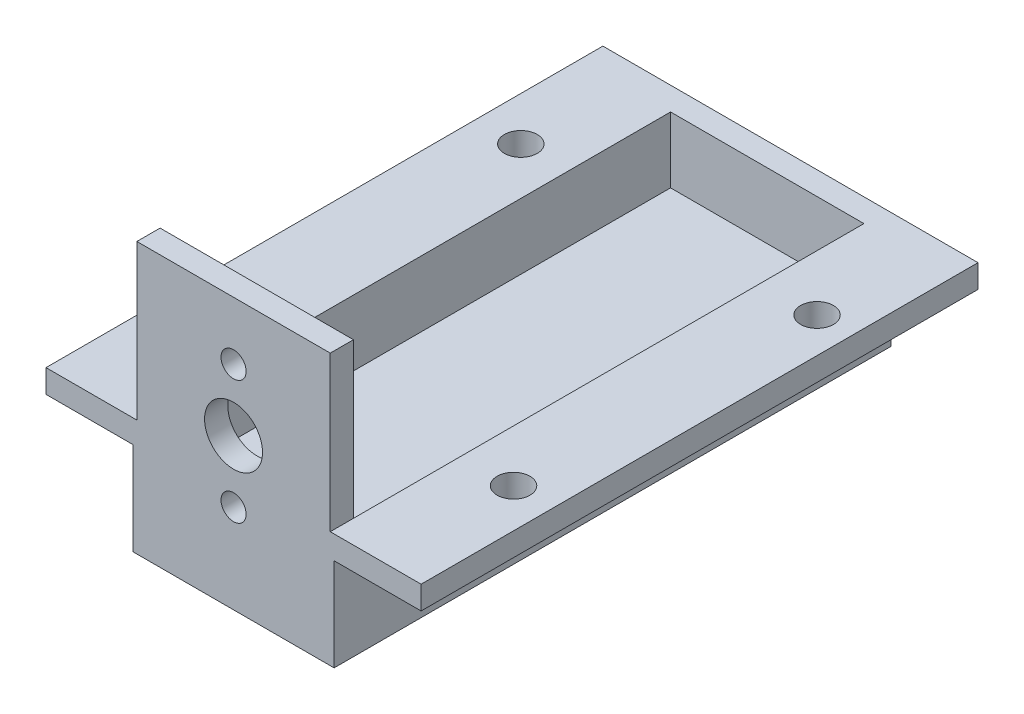
ISO-10303-21;
HEADER;
FILE_DESCRIPTION(('STEP AP214'),'2;1');
FILE_NAME('part.step','',(''),(''),'','','');
FILE_SCHEMA(('AUTOMOTIVE_DESIGN { 1 0 10303 214 1 1 1 1 }'));
ENDSEC;
DATA;
#1=APPLICATION_CONTEXT('core data for automotive mechanical design processes');
#2=APPLICATION_PROTOCOL_DEFINITION('international standard','automotive_design',2000,#1);
#3=PRODUCT_CONTEXT('',#1,'mechanical');
#4=PRODUCT('Part','Part','',(#3));
#5=PRODUCT_RELATED_PRODUCT_CATEGORY('part','',(#4));
#6=PRODUCT_DEFINITION_FORMATION('','',#4);
#7=PRODUCT_DEFINITION_CONTEXT('part definition',#1,'design');
#8=PRODUCT_DEFINITION('design','',#6,#7);
#9=PRODUCT_DEFINITION_SHAPE('','',#8);
#10=(LENGTH_UNIT() NAMED_UNIT(*) SI_UNIT(.MILLI.,.METRE.));
#11=(NAMED_UNIT(*) PLANE_ANGLE_UNIT() SI_UNIT($,.RADIAN.));
#12=(NAMED_UNIT(*) SI_UNIT($,.STERADIAN.) SOLID_ANGLE_UNIT());
#13=UNCERTAINTY_MEASURE_WITH_UNIT(LENGTH_MEASURE(1.E-05),#10,'distance_accuracy_value','');
#14=(GEOMETRIC_REPRESENTATION_CONTEXT(3) GLOBAL_UNCERTAINTY_ASSIGNED_CONTEXT((#13)) GLOBAL_UNIT_ASSIGNED_CONTEXT((#10,
#11,#12)) REPRESENTATION_CONTEXT('',''));
#15=CARTESIAN_POINT('',(0.,0.,0.));
#16=DIRECTION('',(0.,0.,1.));
#17=DIRECTION('',(1.,0.,0.));
#18=AXIS2_PLACEMENT_3D('',#15,#16,#17);
#19=CARTESIAN_POINT('',(12.5,0.,-72.));
#20=DIRECTION('',(1.,0.,0.));
#21=DIRECTION('',(0.,1.,0.));
#22=AXIS2_PLACEMENT_3D('',#19,#20,#21);
#23=PLANE('',#22);
#24=DIRECTION('',(0.,0.,1.));
#25=VECTOR('',#24,1.);
#26=CARTESIAN_POINT('',(12.5,0.,-72.));
#27=LINE('',#26,#25);
#28=CARTESIAN_POINT('',(12.5,0.,-2.99999999999999));
#29=VERTEX_POINT('',#28);
#30=CARTESIAN_POINT('',(12.5,0.,0.));
#31=VERTEX_POINT('',#30);
#32=EDGE_CURVE('E194',#29,#31,#27,.T.);
#33=ORIENTED_EDGE('',*,*,#32,.T.);
#34=DIRECTION('',(0.,-1.,0.));
#35=VECTOR('',#34,1.);
#36=CARTESIAN_POINT('',(12.5,0.,0.));
#37=LINE('',#36,#35);
#38=CARTESIAN_POINT('',(12.5,-20.,0.));
#39=VERTEX_POINT('',#38);
#40=EDGE_CURVE('E173',#31,#39,#37,.T.);
#41=ORIENTED_EDGE('',*,*,#40,.T.);
#42=DIRECTION('',(0.,0.,1.));
#43=VECTOR('',#42,1.);
#44=CARTESIAN_POINT('',(12.5,-20.,-72.));
#45=LINE('',#44,#43);
#46=CARTESIAN_POINT('',(12.5,-20.,-2.99999999999999));
#47=VERTEX_POINT('',#46);
#48=EDGE_CURVE('E197',#47,#39,#45,.T.);
#49=ORIENTED_EDGE('',*,*,#48,.F.);
#50=DIRECTION('',(0.,1.,0.));
#51=VECTOR('',#50,1.);
#52=CARTESIAN_POINT('',(12.5,0.,-2.99999999999999));
#53=LINE('',#52,#51);
#54=EDGE_CURVE('E265',#47,#29,#53,.T.);
#55=ORIENTED_EDGE('',*,*,#54,.T.);
#56=EDGE_LOOP('',(#33,#41,#49,#55));
#57=FACE_BOUND('',#56,.T.);
#58=ADVANCED_FACE('F43',(#57),#23,.T.);
#59=CARTESIAN_POINT('',(12.5,0.,-72.));
#60=DIRECTION('',(0.,-1.,0.));
#61=DIRECTION('',(0.,0.,1.));
#62=AXIS2_PLACEMENT_3D('',#59,#60,#61);
#63=PLANE('',#62);
#64=DIRECTION('',(-1.,0.,0.));
#65=VECTOR('',#64,1.);
#66=CARTESIAN_POINT('',(-12.5,0.,-2.99999999999999));
#67=LINE('',#66,#65);
#68=CARTESIAN_POINT('',(-12.5,0.,-2.99999999999999));
#69=VERTEX_POINT('',#68);
#70=EDGE_CURVE('E162',#29,#69,#67,.T.);
#71=ORIENTED_EDGE('',*,*,#70,.T.);
#72=DIRECTION('',(0.,0.,1.));
#73=VECTOR('',#72,1.);
#74=CARTESIAN_POINT('',(-12.5,0.,-72.));
#75=LINE('',#74,#73);
#76=CARTESIAN_POINT('',(-12.5,0.,0.));
#77=VERTEX_POINT('',#76);
#78=EDGE_CURVE('E191',#69,#77,#75,.T.);
#79=ORIENTED_EDGE('',*,*,#78,.T.);
#80=DIRECTION('',(-1.,0.,0.));
#81=VECTOR('',#80,1.);
#82=CARTESIAN_POINT('',(12.5,0.,0.));
#83=LINE('',#82,#81);
#84=EDGE_CURVE('E176',#31,#77,#83,.T.);
#85=ORIENTED_EDGE('',*,*,#84,.F.);
#86=ORIENTED_EDGE('',*,*,#32,.F.);
#87=EDGE_LOOP('',(#71,#79,#85,#86));
#88=FACE_BOUND('',#87,.T.);
#89=ADVANCED_FACE('F305',(#88),#63,.F.);
#90=CARTESIAN_POINT('',(-12.5,0.,-72.));
#91=DIRECTION('',(1.,0.,0.));
#92=DIRECTION('',(0.,1.,0.));
#93=AXIS2_PLACEMENT_3D('',#90,#91,#92);
#94=PLANE('',#93);
#95=DIRECTION('',(0.,-1.,0.));
#96=VECTOR('',#95,1.);
#97=CARTESIAN_POINT('',(-12.5,0.,-2.99999999999999));
#98=LINE('',#97,#96);
#99=CARTESIAN_POINT('',(-12.5,-20.,-2.99999999999999));
#100=VERTEX_POINT('',#99);
#101=EDGE_CURVE('E254',#69,#100,#98,.T.);
#102=ORIENTED_EDGE('',*,*,#101,.T.);
#103=DIRECTION('',(0.,0.,1.));
#104=VECTOR('',#103,1.);
#105=CARTESIAN_POINT('',(-12.5,-20.,-72.));
#106=LINE('',#105,#104);
#107=CARTESIAN_POINT('',(-12.5,-20.,0.));
#108=VERTEX_POINT('',#107);
#109=EDGE_CURVE('E143',#100,#108,#106,.T.);
#110=ORIENTED_EDGE('',*,*,#109,.T.);
#111=DIRECTION('',(0.,-1.,0.));
#112=VECTOR('',#111,1.);
#113=CARTESIAN_POINT('',(-12.5,0.,0.));
#114=LINE('',#113,#112);
#115=EDGE_CURVE('E179',#77,#108,#114,.T.);
#116=ORIENTED_EDGE('',*,*,#115,.F.);
#117=ORIENTED_EDGE('',*,*,#78,.F.);
#118=EDGE_LOOP('',(#102,#110,#116,#117));
#119=FACE_BOUND('',#118,.T.);
#120=ADVANCED_FACE('F311',(#119),#94,.F.);
#121=CARTESIAN_POINT('',(-13.,-23.,-72.));
#122=DIRECTION('',(1.,0.,0.));
#123=DIRECTION('',(0.,1.,0.));
#124=AXIS2_PLACEMENT_3D('',#121,#122,#123);
#125=PLANE('',#124);
#126=DIRECTION('',(0.,-1.,0.));
#127=VECTOR('',#126,1.);
#128=CARTESIAN_POINT('',(-13.,-23.,0.));
#129=LINE('',#128,#127);
#130=CARTESIAN_POINT('',(-13.,-23.,0.));
#131=VERTEX_POINT('',#130);
#132=CARTESIAN_POINT('',(-13.,-35.,0.));
#133=VERTEX_POINT('',#132);
#134=EDGE_CURVE('E159',#131,#133,#129,.T.);
#135=ORIENTED_EDGE('',*,*,#134,.F.);
#136=DIRECTION('',(0.,0.,1.));
#137=VECTOR('',#136,1.);
#138=CARTESIAN_POINT('',(-13.,-23.,-72.));
#139=LINE('',#138,#137);
#140=CARTESIAN_POINT('',(-13.,-23.,-72.));
#141=VERTEX_POINT('',#140);
#142=EDGE_CURVE('E158',#141,#131,#139,.T.);
#143=ORIENTED_EDGE('',*,*,#142,.F.);
#144=DIRECTION('',(0.,-1.,0.));
#145=VECTOR('',#144,1.);
#146=CARTESIAN_POINT('',(-13.,-23.,-72.));
#147=LINE('',#146,#145);
#148=CARTESIAN_POINT('',(-13.,-35.,-72.));
#149=VERTEX_POINT('',#148);
#150=EDGE_CURVE('E186',#141,#149,#147,.T.);
#151=ORIENTED_EDGE('',*,*,#150,.T.);
#152=DIRECTION('',(0.,0.,1.));
#153=VECTOR('',#152,1.);
#154=CARTESIAN_POINT('',(-13.,-35.,-72.));
#155=LINE('',#154,#153);
#156=EDGE_CURVE('E11',#149,#133,#155,.T.);
#157=ORIENTED_EDGE('',*,*,#156,.T.);
#158=EDGE_LOOP('',(#135,#143,#151,#157));
#159=FACE_BOUND('',#158,.T.);
#160=ADVANCED_FACE('F45',(#159),#125,.F.);
#161=CARTESIAN_POINT('',(-13.,-35.,-72.));
#162=DIRECTION('',(0.,1.,0.));
#163=DIRECTION('',(0.,0.,-1.));
#164=AXIS2_PLACEMENT_3D('',#161,#162,#163);
#165=PLANE('',#164);
#166=DIRECTION('',(1.,0.,0.));
#167=VECTOR('',#166,1.);
#168=CARTESIAN_POINT('',(-13.,-35.,0.));
#169=LINE('',#168,#167);
#170=CARTESIAN_POINT('',(13.,-35.,0.));
#171=VERTEX_POINT('',#170);
#172=EDGE_CURVE('E161',#133,#171,#169,.T.);
#173=ORIENTED_EDGE('',*,*,#172,.F.);
#174=ORIENTED_EDGE('',*,*,#156,.F.);
#175=DIRECTION('',(1.,0.,0.));
#176=VECTOR('',#175,1.);
#177=CARTESIAN_POINT('',(-13.,-35.,-72.));
#178=LINE('',#177,#176);
#179=CARTESIAN_POINT('',(13.,-35.,-72.));
#180=VERTEX_POINT('',#179);
#181=EDGE_CURVE('E113',#149,#180,#178,.T.);
#182=ORIENTED_EDGE('',*,*,#181,.T.);
#183=DIRECTION('',(0.,0.,1.));
#184=VECTOR('',#183,1.);
#185=CARTESIAN_POINT('',(13.,-35.,-72.));
#186=LINE('',#185,#184);
#187=EDGE_CURVE('E53',#180,#171,#186,.T.);
#188=ORIENTED_EDGE('',*,*,#187,.T.);
#189=EDGE_LOOP('',(#173,#174,#182,#188));
#190=FACE_BOUND('',#189,.T.);
#191=ADVANCED_FACE('F286',(#190),#165,.F.);
#192=CARTESIAN_POINT('',(13.,-23.,-72.));
#193=DIRECTION('',(1.,0.,0.));
#194=DIRECTION('',(0.,1.,0.));
#195=AXIS2_PLACEMENT_3D('',#192,#193,#194);
#196=PLANE('',#195);
#197=DIRECTION('',(0.,-1.,0.));
#198=VECTOR('',#197,1.);
#199=CARTESIAN_POINT('',(13.,-23.,0.));
#200=LINE('',#199,#198);
#201=CARTESIAN_POINT('',(13.,-23.,0.));
#202=VERTEX_POINT('',#201);
#203=EDGE_CURVE('E165',#202,#171,#200,.T.);
#204=ORIENTED_EDGE('',*,*,#203,.T.);
#205=ORIENTED_EDGE('',*,*,#187,.F.);
#206=DIRECTION('',(0.,-1.,0.));
#207=VECTOR('',#206,1.);
#208=CARTESIAN_POINT('',(13.,-23.,-72.));
#209=LINE('',#208,#207);
#210=CARTESIAN_POINT('',(13.,-23.,-72.));
#211=VERTEX_POINT('',#210);
#212=EDGE_CURVE('E273',#211,#180,#209,.T.);
#213=ORIENTED_EDGE('',*,*,#212,.F.);
#214=DIRECTION('',(0.,0.,1.));
#215=VECTOR('',#214,1.);
#216=CARTESIAN_POINT('',(13.,-23.,-72.));
#217=LINE('',#216,#215);
#218=EDGE_CURVE('E204',#211,#202,#217,.T.);
#219=ORIENTED_EDGE('',*,*,#218,.T.);
#220=EDGE_LOOP('',(#204,#205,#213,#219));
#221=FACE_BOUND('',#220,.T.);
#222=ADVANCED_FACE('F284',(#221),#196,.T.);
#223=CARTESIAN_POINT('',(24.25,-23.,-72.));
#224=DIRECTION('',(0.,-1.,0.));
#225=DIRECTION('',(0.,0.,1.));
#226=AXIS2_PLACEMENT_3D('',#223,#224,#225);
#227=PLANE('',#226);
#228=CARTESIAN_POINT('',(19.2,-23.,-17.));
#229=DIRECTION('',(0.,1.,0.));
#230=DIRECTION('',(0.,0.,1.));
#231=AXIS2_PLACEMENT_3D('',#228,#229,#230);
#232=CIRCLE('',#231,2.125);
#233=CARTESIAN_POINT('',(19.2,-23.,-14.875));
#234=VERTEX_POINT('',#233);
#235=EDGE_CURVE('E227',#234,#234,#232,.T.);
#236=ORIENTED_EDGE('',*,*,#235,.T.);
#237=EDGE_LOOP('',(#236));
#238=FACE_BOUND('',#237,.T.);
#239=CARTESIAN_POINT('',(19.7,-23.,-55.7379233949007));
#240=DIRECTION('',(0.,1.,0.));
#241=DIRECTION('',(0.,0.,1.));
#242=AXIS2_PLACEMENT_3D('',#239,#240,#241);
#243=CIRCLE('',#242,2.125);
#244=CARTESIAN_POINT('',(19.7,-23.,-53.6129233949007));
#245=VERTEX_POINT('',#244);
#246=EDGE_CURVE('E214',#245,#245,#243,.T.);
#247=ORIENTED_EDGE('',*,*,#246,.T.);
#248=EDGE_LOOP('',(#247));
#249=FACE_BOUND('',#248,.T.);
#250=DIRECTION('',(-1.,0.,0.));
#251=VECTOR('',#250,1.);
#252=CARTESIAN_POINT('',(24.25,-23.,0.));
#253=LINE('',#252,#251);
#254=CARTESIAN_POINT('',(24.25,-23.,0.));
#255=VERTEX_POINT('',#254);
#256=EDGE_CURVE('E167',#255,#202,#253,.T.);
#257=ORIENTED_EDGE('',*,*,#256,.T.);
#258=ORIENTED_EDGE('',*,*,#218,.F.);
#259=DIRECTION('',(-1.,0.,0.));
#260=VECTOR('',#259,1.);
#261=CARTESIAN_POINT('',(24.25,-23.,-72.));
#262=LINE('',#261,#260);
#263=CARTESIAN_POINT('',(24.25,-23.,-72.));
#264=VERTEX_POINT('',#263);
#265=EDGE_CURVE('E153',#264,#211,#262,.T.);
#266=ORIENTED_EDGE('',*,*,#265,.F.);
#267=DIRECTION('',(0.,0.,1.));
#268=VECTOR('',#267,1.);
#269=CARTESIAN_POINT('',(24.25,-23.,-72.));
#270=LINE('',#269,#268);
#271=EDGE_CURVE('E201',#264,#255,#270,.T.);
#272=ORIENTED_EDGE('',*,*,#271,.T.);
#273=EDGE_LOOP('',(#257,#258,#266,#272));
#274=FACE_BOUND('',#273,.T.);
#275=ADVANCED_FACE('F280',(#238,#249,#274),#227,.T.);
#276=CARTESIAN_POINT('',(24.25,-20.,-72.));
#277=DIRECTION('',(1.,0.,0.));
#278=DIRECTION('',(0.,0.,1.));
#279=AXIS2_PLACEMENT_3D('',#276,#277,#278);
#280=PLANE('',#279);
#281=DIRECTION('',(0.,-1.,0.));
#282=VECTOR('',#281,1.);
#283=CARTESIAN_POINT('',(24.25,-20.,0.));
#284=LINE('',#283,#282);
#285=CARTESIAN_POINT('',(24.25,-20.,0.));
#286=VERTEX_POINT('',#285);
#287=EDGE_CURVE('E169',#286,#255,#284,.T.);
#288=ORIENTED_EDGE('',*,*,#287,.T.);
#289=ORIENTED_EDGE('',*,*,#271,.F.);
#290=DIRECTION('',(0.,-1.,0.));
#291=VECTOR('',#290,1.);
#292=CARTESIAN_POINT('',(24.25,-20.,-72.));
#293=LINE('',#292,#291);
#294=CARTESIAN_POINT('',(24.25,-20.,-72.));
#295=VERTEX_POINT('',#294);
#296=EDGE_CURVE('E151',#295,#264,#293,.T.);
#297=ORIENTED_EDGE('',*,*,#296,.F.);
#298=DIRECTION('',(0.,0.,1.));
#299=VECTOR('',#298,1.);
#300=CARTESIAN_POINT('',(24.25,-20.,-72.));
#301=LINE('',#300,#299);
#302=EDGE_CURVE('E149',#295,#286,#301,.T.);
#303=ORIENTED_EDGE('',*,*,#302,.T.);
#304=EDGE_LOOP('',(#288,#289,#297,#303));
#305=FACE_BOUND('',#304,.T.);
#306=ADVANCED_FACE('F316',(#305),#280,.T.);
#307=CARTESIAN_POINT('',(-12.5,-20.,-72.));
#308=DIRECTION('',(0.,-1.,0.));
#309=DIRECTION('',(1.,0.,0.));
#310=AXIS2_PLACEMENT_3D('',#307,#308,#309);
#311=PLANE('',#310);
#312=CARTESIAN_POINT('',(-18.6,-20.,-55.7379233949007));
#313=DIRECTION('',(0.,-1.,0.));
#314=DIRECTION('',(-1.,0.,0.));
#315=AXIS2_PLACEMENT_3D('',#312,#313,#314);
#316=CIRCLE('',#315,2.125);
#317=CARTESIAN_POINT('',(-20.725,-20.,-55.7379233949007));
#318=VERTEX_POINT('',#317);
#319=EDGE_CURVE('E216',#318,#318,#316,.T.);
#320=ORIENTED_EDGE('',*,*,#319,.T.);
#321=EDGE_LOOP('',(#320));
#322=FACE_BOUND('',#321,.T.);
#323=CARTESIAN_POINT('',(19.2,-20.,-17.));
#324=DIRECTION('',(0.,-1.,0.));
#325=DIRECTION('',(-1.,0.,0.));
#326=AXIS2_PLACEMENT_3D('',#323,#324,#325);
#327=CIRCLE('',#326,2.125);
#328=CARTESIAN_POINT('',(17.075,-20.,-17.));
#329=VERTEX_POINT('',#328);
#330=EDGE_CURVE('E221',#329,#329,#327,.T.);
#331=ORIENTED_EDGE('',*,*,#330,.T.);
#332=EDGE_LOOP('',(#331));
#333=FACE_BOUND('',#332,.T.);
#334=CARTESIAN_POINT('',(19.7,-20.,-55.7379233949007));
#335=DIRECTION('',(0.,-1.,0.));
#336=DIRECTION('',(-1.,0.,0.));
#337=AXIS2_PLACEMENT_3D('',#334,#335,#336);
#338=CIRCLE('',#337,2.125);
#339=CARTESIAN_POINT('',(17.575,-20.,-55.7379233949007));
#340=VERTEX_POINT('',#339);
#341=EDGE_CURVE('E346',#340,#340,#338,.T.);
#342=ORIENTED_EDGE('',*,*,#341,.T.);
#343=EDGE_LOOP('',(#342));
#344=FACE_BOUND('',#343,.T.);
#345=CARTESIAN_POINT('',(-18.1,-20.,-17.));
#346=DIRECTION('',(0.,-1.,0.));
#347=DIRECTION('',(-1.,0.,0.));
#348=AXIS2_PLACEMENT_3D('',#345,#346,#347);
#349=CIRCLE('',#348,2.125);
#350=CARTESIAN_POINT('',(-20.225,-20.,-17.));
#351=VERTEX_POINT('',#350);
#352=EDGE_CURVE('E210',#351,#351,#349,.T.);
#353=ORIENTED_EDGE('',*,*,#352,.T.);
#354=EDGE_LOOP('',(#353));
#355=FACE_BOUND('',#354,.T.);
#356=DIRECTION('',(1.,0.,0.));
#357=VECTOR('',#356,1.);
#358=CARTESIAN_POINT('',(12.5,-20.,-69.));
#359=LINE('',#358,#357);
#360=CARTESIAN_POINT('',(-12.5,-20.,-69.));
#361=VERTEX_POINT('',#360);
#362=CARTESIAN_POINT('',(12.5,-20.,-69.));
#363=VERTEX_POINT('',#362);
#364=EDGE_CURVE('E247',#361,#363,#359,.T.);
#365=ORIENTED_EDGE('',*,*,#364,.T.);
#366=DIRECTION('',(0.,0.,1.));
#367=VECTOR('',#366,1.);
#368=CARTESIAN_POINT('',(12.5,-20.,-2.99999999999999));
#369=LINE('',#368,#367);
#370=EDGE_CURVE('E235',#363,#47,#369,.T.);
#371=ORIENTED_EDGE('',*,*,#370,.T.);
#372=ORIENTED_EDGE('',*,*,#48,.T.);
#373=DIRECTION('',(1.,0.,0.));
#374=VECTOR('',#373,1.);
#375=CARTESIAN_POINT('',(12.5,-20.,0.));
#376=LINE('',#375,#374);
#377=EDGE_CURVE('E171',#39,#286,#376,.T.);
#378=ORIENTED_EDGE('',*,*,#377,.T.);
#379=ORIENTED_EDGE('',*,*,#302,.F.);
#380=DIRECTION('',(1.,0.,0.));
#381=VECTOR('',#380,1.);
#382=CARTESIAN_POINT('',(12.5,-20.,-72.));
#383=LINE('',#382,#381);
#384=CARTESIAN_POINT('',(-24.25,-20.,-72.));
#385=VERTEX_POINT('',#384);
#386=EDGE_CURVE('E133',#385,#295,#383,.T.);
#387=ORIENTED_EDGE('',*,*,#386,.F.);
#388=DIRECTION('',(0.,0.,1.));
#389=VECTOR('',#388,1.);
#390=CARTESIAN_POINT('',(-24.25,-20.,-72.));
#391=LINE('',#390,#389);
#392=CARTESIAN_POINT('',(-24.25,-20.,0.));
#393=VERTEX_POINT('',#392);
#394=EDGE_CURVE('E138',#385,#393,#391,.T.);
#395=ORIENTED_EDGE('',*,*,#394,.T.);
#396=DIRECTION('',(-1.,0.,0.));
#397=VECTOR('',#396,1.);
#398=CARTESIAN_POINT('',(-12.5,-20.,0.));
#399=LINE('',#398,#397);
#400=EDGE_CURVE('E182',#108,#393,#399,.T.);
#401=ORIENTED_EDGE('',*,*,#400,.F.);
#402=ORIENTED_EDGE('',*,*,#109,.F.);
#403=DIRECTION('',(0.,0.,-1.));
#404=VECTOR('',#403,1.);
#405=CARTESIAN_POINT('',(-12.5,-20.,-69.));
#406=LINE('',#405,#404);
#407=EDGE_CURVE('E230',#100,#361,#406,.T.);
#408=ORIENTED_EDGE('',*,*,#407,.T.);
#409=EDGE_LOOP('',(#365,#371,#372,#378,#379,#387,#395,#401,#402,#408));
#410=FACE_BOUND('',#409,.T.);
#411=ADVANCED_FACE('F147',(#322,#333,#344,#355,#410),#311,.F.);
#412=CARTESIAN_POINT('',(-24.25,-20.,-72.));
#413=DIRECTION('',(1.,0.,0.));
#414=DIRECTION('',(0.,0.,1.));
#415=AXIS2_PLACEMENT_3D('',#412,#413,#414);
#416=PLANE('',#415);
#417=DIRECTION('',(0.,-1.,0.));
#418=VECTOR('',#417,1.);
#419=CARTESIAN_POINT('',(-24.25,-20.,0.));
#420=LINE('',#419,#418);
#421=CARTESIAN_POINT('',(-24.25,-23.,0.));
#422=VERTEX_POINT('',#421);
#423=EDGE_CURVE('E140',#393,#422,#420,.T.);
#424=ORIENTED_EDGE('',*,*,#423,.F.);
#425=ORIENTED_EDGE('',*,*,#394,.F.);
#426=DIRECTION('',(0.,-1.,0.));
#427=VECTOR('',#426,1.);
#428=CARTESIAN_POINT('',(-24.25,-20.,-72.));
#429=LINE('',#428,#427);
#430=CARTESIAN_POINT('',(-24.25,-23.,-72.));
#431=VERTEX_POINT('',#430);
#432=EDGE_CURVE('E129',#385,#431,#429,.T.);
#433=ORIENTED_EDGE('',*,*,#432,.T.);
#434=DIRECTION('',(0.,0.,1.));
#435=VECTOR('',#434,1.);
#436=CARTESIAN_POINT('',(-24.25,-23.,-72.));
#437=LINE('',#436,#435);
#438=EDGE_CURVE('E144',#431,#422,#437,.T.);
#439=ORIENTED_EDGE('',*,*,#438,.T.);
#440=EDGE_LOOP('',(#424,#425,#433,#439));
#441=FACE_BOUND('',#440,.T.);
#442=ADVANCED_FACE('F139',(#441),#416,.F.);
#443=CARTESIAN_POINT('',(-24.25,-23.,-72.));
#444=DIRECTION('',(0.,1.,0.));
#445=DIRECTION('',(0.,0.,-1.));
#446=AXIS2_PLACEMENT_3D('',#443,#444,#445);
#447=PLANE('',#446);
#448=CARTESIAN_POINT('',(-18.6,-23.,-55.7379233949007));
#449=DIRECTION('',(0.,-1.,0.));
#450=DIRECTION('',(0.,0.,-1.));
#451=AXIS2_PLACEMENT_3D('',#448,#449,#450);
#452=CIRCLE('',#451,2.125);
#453=CARTESIAN_POINT('',(-18.6,-23.,-57.8629233949007));
#454=VERTEX_POINT('',#453);
#455=EDGE_CURVE('E47',#454,#454,#452,.T.);
#456=ORIENTED_EDGE('',*,*,#455,.F.);
#457=EDGE_LOOP('',(#456));
#458=FACE_BOUND('',#457,.T.);
#459=CARTESIAN_POINT('',(-18.1,-23.,-17.));
#460=DIRECTION('',(0.,-1.,0.));
#461=DIRECTION('',(0.,0.,-1.));
#462=AXIS2_PLACEMENT_3D('',#459,#460,#461);
#463=CIRCLE('',#462,2.125);
#464=CARTESIAN_POINT('',(-18.1,-23.,-19.125));
#465=VERTEX_POINT('',#464);
#466=EDGE_CURVE('E208',#465,#465,#463,.T.);
#467=ORIENTED_EDGE('',*,*,#466,.F.);
#468=EDGE_LOOP('',(#467));
#469=FACE_BOUND('',#468,.T.);
#470=DIRECTION('',(1.,0.,0.));
#471=VECTOR('',#470,1.);
#472=CARTESIAN_POINT('',(-24.25,-23.,0.));
#473=LINE('',#472,#471);
#474=EDGE_CURVE('E101',#422,#131,#473,.T.);
#475=ORIENTED_EDGE('',*,*,#474,.F.);
#476=ORIENTED_EDGE('',*,*,#438,.F.);
#477=DIRECTION('',(1.,0.,0.));
#478=VECTOR('',#477,1.);
#479=CARTESIAN_POINT('',(-24.25,-23.,-72.));
#480=LINE('',#479,#478);
#481=EDGE_CURVE('E62',#431,#141,#480,.T.);
#482=ORIENTED_EDGE('',*,*,#481,.T.);
#483=ORIENTED_EDGE('',*,*,#142,.T.);
#484=EDGE_LOOP('',(#475,#476,#482,#483));
#485=FACE_BOUND('',#484,.T.);
#486=ADVANCED_FACE('F290',(#458,#469,#485),#447,.F.);
#487=CARTESIAN_POINT('',(0.,0.,-72.));
#488=DIRECTION('',(0.,0.,-1.));
#489=DIRECTION('',(1.,0.,0.));
#490=AXIS2_PLACEMENT_3D('',#487,#488,#489);
#491=PLANE('',#490);
#492=ORIENTED_EDGE('',*,*,#386,.T.);
#493=ORIENTED_EDGE('',*,*,#296,.T.);
#494=ORIENTED_EDGE('',*,*,#265,.T.);
#495=ORIENTED_EDGE('',*,*,#212,.T.);
#496=ORIENTED_EDGE('',*,*,#181,.F.);
#497=ORIENTED_EDGE('',*,*,#150,.F.);
#498=ORIENTED_EDGE('',*,*,#481,.F.);
#499=ORIENTED_EDGE('',*,*,#432,.F.);
#500=EDGE_LOOP('',(#492,#493,#494,#495,#496,#497,#498,#499));
#501=FACE_BOUND('',#500,.T.);
#502=ADVANCED_FACE('F131',(#501),#491,.T.);
#503=CARTESIAN_POINT('',(0.,0.,0.));
#504=DIRECTION('',(0.,0.,-1.));
#505=DIRECTION('',(1.,0.,0.));
#506=AXIS2_PLACEMENT_3D('',#503,#504,#505);
#507=PLANE('',#506);
#508=CARTESIAN_POINT('',(0.,-7.5,0.));
#509=DIRECTION('',(0.,0.,-1.));
#510=DIRECTION('',(-1.,0.,0.));
#511=AXIS2_PLACEMENT_3D('',#508,#509,#510);
#512=CIRCLE('',#511,1.625);
#513=CARTESIAN_POINT('',(-1.625,-7.5,0.));
#514=VERTEX_POINT('',#513);
#515=EDGE_CURVE('E351',#514,#514,#512,.T.);
#516=ORIENTED_EDGE('',*,*,#515,.T.);
#517=EDGE_LOOP('',(#516));
#518=FACE_BOUND('',#517,.T.);
#519=CARTESIAN_POINT('',(0.,-15.5,0.));
#520=DIRECTION('',(0.,0.,-1.));
#521=DIRECTION('',(-1.,0.,0.));
#522=AXIS2_PLACEMENT_3D('',#519,#520,#521);
#523=CIRCLE('',#522,3.75);
#524=CARTESIAN_POINT('',(-3.75,-15.5,0.));
#525=VERTEX_POINT('',#524);
#526=EDGE_CURVE('E363',#525,#525,#523,.T.);
#527=ORIENTED_EDGE('',*,*,#526,.T.);
#528=EDGE_LOOP('',(#527));
#529=FACE_BOUND('',#528,.T.);
#530=CARTESIAN_POINT('',(0.,-23.5,0.));
#531=DIRECTION('',(0.,0.,-1.));
#532=DIRECTION('',(-1.,0.,0.));
#533=AXIS2_PLACEMENT_3D('',#530,#531,#532);
#534=CIRCLE('',#533,1.625);
#535=CARTESIAN_POINT('',(-1.625,-23.5,0.));
#536=VERTEX_POINT('',#535);
#537=EDGE_CURVE('E357',#536,#536,#534,.T.);
#538=ORIENTED_EDGE('',*,*,#537,.T.);
#539=EDGE_LOOP('',(#538));
#540=FACE_BOUND('',#539,.T.);
#541=ORIENTED_EDGE('',*,*,#134,.T.);
#542=ORIENTED_EDGE('',*,*,#172,.T.);
#543=ORIENTED_EDGE('',*,*,#203,.F.);
#544=ORIENTED_EDGE('',*,*,#256,.F.);
#545=ORIENTED_EDGE('',*,*,#287,.F.);
#546=ORIENTED_EDGE('',*,*,#377,.F.);
#547=ORIENTED_EDGE('',*,*,#40,.F.);
#548=ORIENTED_EDGE('',*,*,#84,.T.);
#549=ORIENTED_EDGE('',*,*,#115,.T.);
#550=ORIENTED_EDGE('',*,*,#400,.T.);
#551=ORIENTED_EDGE('',*,*,#423,.T.);
#552=ORIENTED_EDGE('',*,*,#474,.T.);
#553=EDGE_LOOP('',(#541,#542,#543,#544,#545,#546,#547,#548,#549,#550,#551,#552));
#554=FACE_BOUND('',#553,.T.);
#555=ADVANCED_FACE('F298',(#518,#529,#540,#554),#507,.F.);
#556=CARTESIAN_POINT('',(0.,0.,-2.99999999999999));
#557=DIRECTION('',(0.,0.,-1.));
#558=DIRECTION('',(1.,0.,0.));
#559=AXIS2_PLACEMENT_3D('',#556,#557,#558);
#560=PLANE('',#559);
#561=CARTESIAN_POINT('',(0.,-7.5,-3.));
#562=DIRECTION('',(0.,0.,-1.));
#563=DIRECTION('',(-1.,0.,0.));
#564=AXIS2_PLACEMENT_3D('',#561,#562,#563);
#565=CIRCLE('',#564,1.625);
#566=CARTESIAN_POINT('',(-1.625,-7.5,-3.));
#567=VERTEX_POINT('',#566);
#568=EDGE_CURVE('E348',#567,#567,#565,.T.);
#569=ORIENTED_EDGE('',*,*,#568,.F.);
#570=EDGE_LOOP('',(#569));
#571=FACE_BOUND('',#570,.T.);
#572=CARTESIAN_POINT('',(0.,-15.5,-3.));
#573=DIRECTION('',(0.,0.,-1.));
#574=DIRECTION('',(-1.,0.,0.));
#575=AXIS2_PLACEMENT_3D('',#572,#573,#574);
#576=CIRCLE('',#575,3.75);
#577=CARTESIAN_POINT('',(-3.75,-15.5,-3.));
#578=VERTEX_POINT('',#577);
#579=EDGE_CURVE('E360',#578,#578,#576,.T.);
#580=ORIENTED_EDGE('',*,*,#579,.F.);
#581=EDGE_LOOP('',(#580));
#582=FACE_BOUND('',#581,.T.);
#583=CARTESIAN_POINT('',(0.,-23.5,-3.));
#584=DIRECTION('',(0.,0.,-1.));
#585=DIRECTION('',(-1.,0.,0.));
#586=AXIS2_PLACEMENT_3D('',#583,#584,#585);
#587=CIRCLE('',#586,1.625);
#588=CARTESIAN_POINT('',(-1.625,-23.5,-3.));
#589=VERTEX_POINT('',#588);
#590=EDGE_CURVE('E354',#589,#589,#587,.T.);
#591=ORIENTED_EDGE('',*,*,#590,.F.);
#592=EDGE_LOOP('',(#591));
#593=FACE_BOUND('',#592,.T.);
#594=ORIENTED_EDGE('',*,*,#101,.F.);
#595=ORIENTED_EDGE('',*,*,#70,.F.);
#596=ORIENTED_EDGE('',*,*,#54,.F.);
#597=DIRECTION('',(0.,1.,0.));
#598=VECTOR('',#597,1.);
#599=CARTESIAN_POINT('',(12.5,-28.5,-2.99999999999999));
#600=LINE('',#599,#598);
#601=CARTESIAN_POINT('',(12.5,-28.5,-2.99999999999999));
#602=VERTEX_POINT('',#601);
#603=EDGE_CURVE('E255',#602,#47,#600,.T.);
#604=ORIENTED_EDGE('',*,*,#603,.F.);
#605=DIRECTION('',(-1.,0.,0.));
#606=VECTOR('',#605,1.);
#607=CARTESIAN_POINT('',(-12.5,-28.5,-2.99999999999999));
#608=LINE('',#607,#606);
#609=CARTESIAN_POINT('',(-12.5,-28.5,-2.99999999999999));
#610=VERTEX_POINT('',#609);
#611=EDGE_CURVE('E241',#602,#610,#608,.T.);
#612=ORIENTED_EDGE('',*,*,#611,.T.);
#613=DIRECTION('',(0.,1.,0.));
#614=VECTOR('',#613,1.);
#615=CARTESIAN_POINT('',(-12.5,-28.5,-2.99999999999999));
#616=LINE('',#615,#614);
#617=EDGE_CURVE('E251',#610,#100,#616,.T.);
#618=ORIENTED_EDGE('',*,*,#617,.T.);
#619=EDGE_LOOP('',(#594,#595,#596,#604,#612,#618));
#620=FACE_BOUND('',#619,.T.);
#621=ADVANCED_FACE('F417',(#571,#582,#593,#620),#560,.T.);
#622=CARTESIAN_POINT('',(-12.5,-28.5,-69.));
#623=DIRECTION('',(-1.,0.,0.));
#624=DIRECTION('',(0.,-1.,0.));
#625=AXIS2_PLACEMENT_3D('',#622,#623,#624);
#626=PLANE('',#625);
#627=ORIENTED_EDGE('',*,*,#407,.F.);
#628=ORIENTED_EDGE('',*,*,#617,.F.);
#629=DIRECTION('',(0.,0.,-1.));
#630=VECTOR('',#629,1.);
#631=CARTESIAN_POINT('',(-12.5,-28.5,-69.));
#632=LINE('',#631,#630);
#633=CARTESIAN_POINT('',(-12.5,-28.5,-69.));
#634=VERTEX_POINT('',#633);
#635=EDGE_CURVE('E231',#610,#634,#632,.T.);
#636=ORIENTED_EDGE('',*,*,#635,.T.);
#637=DIRECTION('',(0.,1.,0.));
#638=VECTOR('',#637,1.);
#639=CARTESIAN_POINT('',(-12.5,-28.5,-69.));
#640=LINE('',#639,#638);
#641=EDGE_CURVE('E244',#634,#361,#640,.T.);
#642=ORIENTED_EDGE('',*,*,#641,.T.);
#643=EDGE_LOOP('',(#627,#628,#636,#642));
#644=FACE_BOUND('',#643,.T.);
#645=ADVANCED_FACE('F410',(#644),#626,.F.);
#646=CARTESIAN_POINT('',(12.5,-28.5,-2.99999999999999));
#647=DIRECTION('',(1.,0.,0.));
#648=DIRECTION('',(0.,1.,0.));
#649=AXIS2_PLACEMENT_3D('',#646,#647,#648);
#650=PLANE('',#649);
#651=ORIENTED_EDGE('',*,*,#370,.F.);
#652=DIRECTION('',(0.,1.,0.));
#653=VECTOR('',#652,1.);
#654=CARTESIAN_POINT('',(12.5,-28.5,-69.));
#655=LINE('',#654,#653);
#656=CARTESIAN_POINT('',(12.5,-28.5,-69.));
#657=VERTEX_POINT('',#656);
#658=EDGE_CURVE('E258',#657,#363,#655,.T.);
#659=ORIENTED_EDGE('',*,*,#658,.F.);
#660=DIRECTION('',(0.,0.,1.));
#661=VECTOR('',#660,1.);
#662=CARTESIAN_POINT('',(12.5,-28.5,-2.99999999999999));
#663=LINE('',#662,#661);
#664=EDGE_CURVE('E238',#657,#602,#663,.T.);
#665=ORIENTED_EDGE('',*,*,#664,.T.);
#666=ORIENTED_EDGE('',*,*,#603,.T.);
#667=EDGE_LOOP('',(#651,#659,#665,#666));
#668=FACE_BOUND('',#667,.T.);
#669=ADVANCED_FACE('F407',(#668),#650,.F.);
#670=CARTESIAN_POINT('',(12.5,-28.5,-69.));
#671=DIRECTION('',(0.,0.,-1.));
#672=DIRECTION('',(1.,0.,0.));
#673=AXIS2_PLACEMENT_3D('',#670,#671,#672);
#674=PLANE('',#673);
#675=ORIENTED_EDGE('',*,*,#364,.F.);
#676=ORIENTED_EDGE('',*,*,#641,.F.);
#677=DIRECTION('',(1.,0.,0.));
#678=VECTOR('',#677,1.);
#679=CARTESIAN_POINT('',(12.5,-28.5,-69.));
#680=LINE('',#679,#678);
#681=EDGE_CURVE('E234',#634,#657,#680,.T.);
#682=ORIENTED_EDGE('',*,*,#681,.T.);
#683=ORIENTED_EDGE('',*,*,#658,.T.);
#684=EDGE_LOOP('',(#675,#676,#682,#683));
#685=FACE_BOUND('',#684,.T.);
#686=ADVANCED_FACE('F405',(#685),#674,.F.);
#687=CARTESIAN_POINT('',(0.,-28.5,0.));
#688=DIRECTION('',(0.,-1.,0.));
#689=DIRECTION('',(1.,0.,0.));
#690=AXIS2_PLACEMENT_3D('',#687,#688,#689);
#691=PLANE('',#690);
#692=ORIENTED_EDGE('',*,*,#635,.F.);
#693=ORIENTED_EDGE('',*,*,#611,.F.);
#694=ORIENTED_EDGE('',*,*,#664,.F.);
#695=ORIENTED_EDGE('',*,*,#681,.F.);
#696=EDGE_LOOP('',(#692,#693,#694,#695));
#697=FACE_BOUND('',#696,.T.);
#698=ADVANCED_FACE('F401',(#697),#691,.F.);
#699=CARTESIAN_POINT('',(-18.1,-28.5,-17.));
#700=DIRECTION('',(0.,1.,0.));
#701=DIRECTION('',(-1.,0.,0.));
#702=AXIS2_PLACEMENT_3D('',#699,#700,#701);
#703=CYLINDRICAL_SURFACE('',#702,2.125);
#704=ORIENTED_EDGE('',*,*,#352,.F.);
#705=EDGE_LOOP('',(#704));
#706=FACE_BOUND('',#705,.T.);
#707=ORIENTED_EDGE('',*,*,#466,.T.);
#708=EDGE_LOOP('',(#707));
#709=FACE_BOUND('',#708,.T.);
#710=ADVANCED_FACE('F394',(#706,#709),#703,.F.);
#711=CARTESIAN_POINT('',(-18.6,-28.5,-55.7379233949007));
#712=DIRECTION('',(0.,1.,0.));
#713=DIRECTION('',(-1.,0.,0.));
#714=AXIS2_PLACEMENT_3D('',#711,#712,#713);
#715=CYLINDRICAL_SURFACE('',#714,2.125);
#716=ORIENTED_EDGE('',*,*,#319,.F.);
#717=EDGE_LOOP('',(#716));
#718=FACE_BOUND('',#717,.T.);
#719=ORIENTED_EDGE('',*,*,#455,.T.);
#720=EDGE_LOOP('',(#719));
#721=FACE_BOUND('',#720,.T.);
#722=ADVANCED_FACE('F390',(#718,#721),#715,.F.);
#723=CARTESIAN_POINT('',(19.7,-28.5,-55.7379233949007));
#724=DIRECTION('',(0.,1.,0.));
#725=DIRECTION('',(-1.,0.,0.));
#726=AXIS2_PLACEMENT_3D('',#723,#724,#725);
#727=CYLINDRICAL_SURFACE('',#726,2.125);
#728=ORIENTED_EDGE('',*,*,#246,.F.);
#729=EDGE_LOOP('',(#728));
#730=FACE_BOUND('',#729,.T.);
#731=ORIENTED_EDGE('',*,*,#341,.F.);
#732=EDGE_LOOP('',(#731));
#733=FACE_BOUND('',#732,.T.);
#734=ADVANCED_FACE('F387',(#730,#733),#727,.F.);
#735=CARTESIAN_POINT('',(19.2,-28.5,-17.));
#736=DIRECTION('',(0.,1.,0.));
#737=DIRECTION('',(-1.,0.,0.));
#738=AXIS2_PLACEMENT_3D('',#735,#736,#737);
#739=CYLINDRICAL_SURFACE('',#738,2.125);
#740=ORIENTED_EDGE('',*,*,#235,.F.);
#741=EDGE_LOOP('',(#740));
#742=FACE_BOUND('',#741,.T.);
#743=ORIENTED_EDGE('',*,*,#330,.F.);
#744=EDGE_LOOP('',(#743));
#745=FACE_BOUND('',#744,.T.);
#746=ADVANCED_FACE('F385',(#742,#745),#739,.F.);
#747=CARTESIAN_POINT('',(0.,-23.5,-3.));
#748=DIRECTION('',(0.,0.,1.));
#749=DIRECTION('',(-1.,0.,0.));
#750=AXIS2_PLACEMENT_3D('',#747,#748,#749);
#751=CYLINDRICAL_SURFACE('',#750,1.625);
#752=ORIENTED_EDGE('',*,*,#590,.T.);
#753=EDGE_LOOP('',(#752));
#754=FACE_BOUND('',#753,.T.);
#755=ORIENTED_EDGE('',*,*,#537,.F.);
#756=EDGE_LOOP('',(#755));
#757=FACE_BOUND('',#756,.T.);
#758=ADVANCED_FACE('F379',(#754,#757),#751,.F.);
#759=CARTESIAN_POINT('',(0.,-15.5,-3.));
#760=DIRECTION('',(0.,0.,1.));
#761=DIRECTION('',(-1.,0.,0.));
#762=AXIS2_PLACEMENT_3D('',#759,#760,#761);
#763=CYLINDRICAL_SURFACE('',#762,3.75);
#764=ORIENTED_EDGE('',*,*,#579,.T.);
#765=EDGE_LOOP('',(#764));
#766=FACE_BOUND('',#765,.T.);
#767=ORIENTED_EDGE('',*,*,#526,.F.);
#768=EDGE_LOOP('',(#767));
#769=FACE_BOUND('',#768,.T.);
#770=ADVANCED_FACE('F373',(#766,#769),#763,.F.);
#771=CARTESIAN_POINT('',(0.,-7.5,-3.));
#772=DIRECTION('',(0.,0.,1.));
#773=DIRECTION('',(-1.,0.,0.));
#774=AXIS2_PLACEMENT_3D('',#771,#772,#773);
#775=CYLINDRICAL_SURFACE('',#774,1.625);
#776=ORIENTED_EDGE('',*,*,#568,.T.);
#777=EDGE_LOOP('',(#776));
#778=FACE_BOUND('',#777,.T.);
#779=ORIENTED_EDGE('',*,*,#515,.F.);
#780=EDGE_LOOP('',(#779));
#781=FACE_BOUND('',#780,.T.);
#782=ADVANCED_FACE('F371',(#778,#781),#775,.F.);
#783=CLOSED_SHELL('',(#58,#89,#120,#160,#191,#222,#275,#306,#411,#442,#486,#502,#555,#621,#645,
#669,#686,#698,#710,#722,#734,#746,#758,#770,#782));
#784=MANIFOLD_SOLID_BREP('B2',#783);
#785=ADVANCED_BREP_SHAPE_REPRESENTATION('',(#18,#784),#14);
#786=SHAPE_DEFINITION_REPRESENTATION(#9,#785);
ENDSEC;
END-ISO-10303-21;
